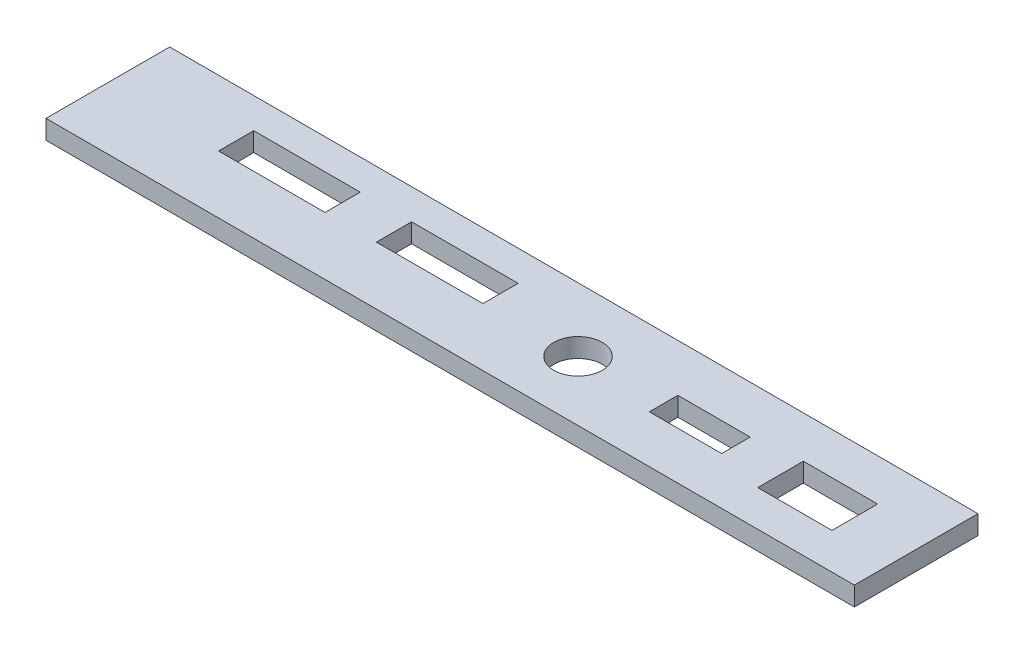
ISO-10303-21;
HEADER;
FILE_DESCRIPTION(('STEP AP214'),'2;1');
FILE_NAME('part.step','',(''),(''),'','','');
FILE_SCHEMA(('AUTOMOTIVE_DESIGN { 1 0 10303 214 1 1 1 1 }'));
ENDSEC;
DATA;
#1=APPLICATION_CONTEXT('core data for automotive mechanical design processes');
#2=APPLICATION_PROTOCOL_DEFINITION('international standard','automotive_design',2000,#1);
#3=PRODUCT_CONTEXT('',#1,'mechanical');
#4=PRODUCT('Part','Part','',(#3));
#5=PRODUCT_RELATED_PRODUCT_CATEGORY('part','',(#4));
#6=PRODUCT_DEFINITION_FORMATION('','',#4);
#7=PRODUCT_DEFINITION_CONTEXT('part definition',#1,'design');
#8=PRODUCT_DEFINITION('design','',#6,#7);
#9=PRODUCT_DEFINITION_SHAPE('','',#8);
#10=(LENGTH_UNIT() NAMED_UNIT(*) SI_UNIT(.MILLI.,.METRE.));
#11=(NAMED_UNIT(*) PLANE_ANGLE_UNIT() SI_UNIT($,.RADIAN.));
#12=(NAMED_UNIT(*) SI_UNIT($,.STERADIAN.) SOLID_ANGLE_UNIT());
#13=UNCERTAINTY_MEASURE_WITH_UNIT(LENGTH_MEASURE(1.E-05),#10,'distance_accuracy_value','');
#14=(GEOMETRIC_REPRESENTATION_CONTEXT(3) GLOBAL_UNCERTAINTY_ASSIGNED_CONTEXT((#13)) GLOBAL_UNIT_ASSIGNED_CONTEXT((#10,
#11,#12)) REPRESENTATION_CONTEXT('',''));
#15=CARTESIAN_POINT('',(0.,0.,0.));
#16=DIRECTION('',(0.,0.,1.));
#17=DIRECTION('',(1.,0.,0.));
#18=AXIS2_PLACEMENT_3D('',#15,#16,#17);
#19=CARTESIAN_POINT('',(0.,2.,0.));
#20=DIRECTION('',(0.,1.,0.));
#21=DIRECTION('',(0.,0.,1.));
#22=AXIS2_PLACEMENT_3D('',#19,#20,#21);
#23=PLANE('',#22);
#24=DIRECTION('',(-1.,0.,0.));
#25=VECTOR('',#24,1.);
#26=CARTESIAN_POINT('',(29.7913481709879,2.,-0.831151968342928));
#27=LINE('',#26,#25);
#28=CARTESIAN_POINT('',(29.7913481709879,2.,-0.831151968342928));
#29=VERTEX_POINT('',#28);
#30=CARTESIAN_POINT('',(18.5913481709879,2.,-0.831151968342926));
#31=VERTEX_POINT('',#30);
#32=EDGE_CURVE('E236',#29,#31,#27,.T.);
#33=ORIENTED_EDGE('',*,*,#32,.F.);
#34=DIRECTION('',(0.,0.,-1.));
#35=VECTOR('',#34,1.);
#36=CARTESIAN_POINT('',(29.7913481709879,2.,2.86884803165707));
#37=LINE('',#36,#35);
#38=CARTESIAN_POINT('',(29.7913481709879,2.,2.86884803165707));
#39=VERTEX_POINT('',#38);
#40=EDGE_CURVE('E233',#39,#29,#37,.T.);
#41=ORIENTED_EDGE('',*,*,#40,.F.);
#42=DIRECTION('',(1.,0.,0.));
#43=VECTOR('',#42,1.);
#44=CARTESIAN_POINT('',(29.7913481709879,2.,2.86884803165707));
#45=LINE('',#44,#43);
#46=CARTESIAN_POINT('',(18.5913481709879,2.,2.86884803165707));
#47=VERTEX_POINT('',#46);
#48=EDGE_CURVE('E244',#47,#39,#45,.T.);
#49=ORIENTED_EDGE('',*,*,#48,.F.);
#50=DIRECTION('',(0.,0.,1.));
#51=VECTOR('',#50,1.);
#52=CARTESIAN_POINT('',(18.5913481709879,2.,2.86884803165707));
#53=LINE('',#52,#51);
#54=EDGE_CURVE('E240',#31,#47,#53,.T.);
#55=ORIENTED_EDGE('',*,*,#54,.F.);
#56=EDGE_LOOP('',(#33,#41,#49,#55));
#57=FACE_BOUND('',#56,.T.);
#58=DIRECTION('',(-1.,0.,0.));
#59=VECTOR('',#58,1.);
#60=CARTESIAN_POINT('',(55.9913481709879,2.,0.96884803165707));
#61=LINE('',#60,#59);
#62=CARTESIAN_POINT('',(55.9913481709879,2.,0.96884803165707));
#63=VERTEX_POINT('',#62);
#64=CARTESIAN_POINT('',(48.3913481709879,2.,0.968848031657071));
#65=VERTEX_POINT('',#64);
#66=EDGE_CURVE('E279',#63,#65,#61,.T.);
#67=ORIENTED_EDGE('',*,*,#66,.F.);
#68=DIRECTION('',(0.,0.,-1.));
#69=VECTOR('',#68,1.);
#70=CARTESIAN_POINT('',(55.9913481709879,2.,3.96884803165707));
#71=LINE('',#70,#69);
#72=CARTESIAN_POINT('',(55.9913481709879,2.,3.96884803165707));
#73=VERTEX_POINT('',#72);
#74=EDGE_CURVE('E276',#73,#63,#71,.T.);
#75=ORIENTED_EDGE('',*,*,#74,.F.);
#76=DIRECTION('',(1.,0.,0.));
#77=VECTOR('',#76,1.);
#78=CARTESIAN_POINT('',(55.9913481709879,2.,3.96884803165707));
#79=LINE('',#78,#77);
#80=CARTESIAN_POINT('',(48.3913481709879,2.,3.96884803165707));
#81=VERTEX_POINT('',#80);
#82=EDGE_CURVE('E287',#81,#73,#79,.T.);
#83=ORIENTED_EDGE('',*,*,#82,.F.);
#84=DIRECTION('',(0.,0.,1.));
#85=VECTOR('',#84,1.);
#86=CARTESIAN_POINT('',(48.3913481709879,2.,3.96884803165707));
#87=LINE('',#86,#85);
#88=EDGE_CURVE('E283',#65,#81,#87,.T.);
#89=ORIENTED_EDGE('',*,*,#88,.F.);
#90=EDGE_LOOP('',(#67,#75,#83,#89));
#91=FACE_BOUND('',#90,.T.);
#92=DIRECTION('',(-1.,0.,0.));
#93=VECTOR('',#92,1.);
#94=CARTESIAN_POINT('',(68.7913481709879,2.,0.368848031657069));
#95=LINE('',#94,#93);
#96=CARTESIAN_POINT('',(68.7913481709879,2.,0.368848031657069));
#97=VERTEX_POINT('',#96);
#98=CARTESIAN_POINT('',(60.9913481709879,2.,0.36884803165707));
#99=VERTEX_POINT('',#98);
#100=EDGE_CURVE('E322',#97,#99,#95,.T.);
#101=ORIENTED_EDGE('',*,*,#100,.F.);
#102=DIRECTION('',(0.,0.,-1.));
#103=VECTOR('',#102,1.);
#104=CARTESIAN_POINT('',(68.7913481709879,2.,5.16884803165707));
#105=LINE('',#104,#103);
#106=CARTESIAN_POINT('',(68.7913481709879,2.,5.16884803165707));
#107=VERTEX_POINT('',#106);
#108=EDGE_CURVE('E319',#107,#97,#105,.T.);
#109=ORIENTED_EDGE('',*,*,#108,.F.);
#110=DIRECTION('',(1.,0.,0.));
#111=VECTOR('',#110,1.);
#112=CARTESIAN_POINT('',(68.7913481709879,2.,5.16884803165707));
#113=LINE('',#112,#111);
#114=CARTESIAN_POINT('',(60.9913481709879,2.,5.16884803165707));
#115=VERTEX_POINT('',#114);
#116=EDGE_CURVE('E330',#115,#107,#113,.T.);
#117=ORIENTED_EDGE('',*,*,#116,.F.);
#118=DIRECTION('',(0.,0.,1.));
#119=VECTOR('',#118,1.);
#120=CARTESIAN_POINT('',(60.9913481709879,2.,5.16884803165707));
#121=LINE('',#120,#119);
#122=EDGE_CURVE('E326',#99,#115,#121,.T.);
#123=ORIENTED_EDGE('',*,*,#122,.F.);
#124=EDGE_LOOP('',(#101,#109,#117,#123));
#125=FACE_BOUND('',#124,.T.);
#126=DIRECTION('',(0.,0.,1.));
#127=VECTOR('',#126,1.);
#128=CARTESIAN_POINT('',(-10.0513698630137,2.,-4.03115196834293));
#129=LINE('',#128,#127);
#130=CARTESIAN_POINT('',(-10.0513698630137,2.,-4.03115196834293));
#131=VERTEX_POINT('',#130);
#132=CARTESIAN_POINT('',(-10.0513698630137,2.,8.96884803165707));
#133=VERTEX_POINT('',#132);
#134=EDGE_CURVE('E362',#131,#133,#129,.T.);
#135=ORIENTED_EDGE('',*,*,#134,.T.);
#136=DIRECTION('',(1.,0.,0.));
#137=VECTOR('',#136,1.);
#138=CARTESIAN_POINT('',(-10.0513698630137,2.,8.96884803165707));
#139=LINE('',#138,#137);
#140=CARTESIAN_POINT('',(74.9486301369863,2.,8.96884803165707));
#141=VERTEX_POINT('',#140);
#142=EDGE_CURVE('E366',#133,#141,#139,.T.);
#143=ORIENTED_EDGE('',*,*,#142,.T.);
#144=DIRECTION('',(0.,0.,-1.));
#145=VECTOR('',#144,1.);
#146=CARTESIAN_POINT('',(74.9486301369863,2.,-4.03115196834293));
#147=LINE('',#146,#145);
#148=CARTESIAN_POINT('',(74.9486301369863,2.,-4.03115196834293));
#149=VERTEX_POINT('',#148);
#150=EDGE_CURVE('E370',#141,#149,#147,.T.);
#151=ORIENTED_EDGE('',*,*,#150,.T.);
#152=DIRECTION('',(-1.,0.,0.));
#153=VECTOR('',#152,1.);
#154=CARTESIAN_POINT('',(-10.0513698630137,2.,-4.03115196834293));
#155=LINE('',#154,#153);
#156=EDGE_CURVE('E373',#149,#131,#155,.T.);
#157=ORIENTED_EDGE('',*,*,#156,.T.);
#158=EDGE_LOOP('',(#135,#143,#151,#157));
#159=FACE_BOUND('',#158,.T.);
#160=CARTESIAN_POINT('',(39.5913481709879,2.,2.66884803165707));
#161=DIRECTION('',(0.,1.,0.));
#162=DIRECTION('',(0.,0.,1.));
#163=AXIS2_PLACEMENT_3D('',#160,#161,#162);
#164=CIRCLE('',#163,2.55);
#165=CARTESIAN_POINT('',(39.5913481709879,2.,5.21884803165707));
#166=VERTEX_POINT('',#165);
#167=EDGE_CURVE('E225',#166,#166,#164,.T.);
#168=ORIENTED_EDGE('',*,*,#167,.F.);
#169=EDGE_LOOP('',(#168));
#170=FACE_BOUND('',#169,.T.);
#171=DIRECTION('',(1.,0.,0.));
#172=VECTOR('',#171,1.);
#173=CARTESIAN_POINT('',(1.99134817098792,2.,2.86884803165707));
#174=LINE('',#173,#172);
#175=CARTESIAN_POINT('',(1.99134817098792,2.,2.86884803165707));
#176=VERTEX_POINT('',#175);
#177=CARTESIAN_POINT('',(13.1913481709879,2.,2.86884803165707));
#178=VERTEX_POINT('',#177);
#179=EDGE_CURVE('E186',#176,#178,#174,.T.);
#180=ORIENTED_EDGE('',*,*,#179,.F.);
#181=DIRECTION('',(0.,0.,1.));
#182=VECTOR('',#181,1.);
#183=CARTESIAN_POINT('',(1.99134817098792,2.,-0.831151968342934));
#184=LINE('',#183,#182);
#185=CARTESIAN_POINT('',(1.99134817098792,2.,-0.831151968342934));
#186=VERTEX_POINT('',#185);
#187=EDGE_CURVE('E177',#186,#176,#184,.T.);
#188=ORIENTED_EDGE('',*,*,#187,.F.);
#189=DIRECTION('',(-1.,0.,0.));
#190=VECTOR('',#189,1.);
#191=CARTESIAN_POINT('',(1.99134817098792,2.,-0.831151968342934));
#192=LINE('',#191,#190);
#193=CARTESIAN_POINT('',(13.1913481709879,2.,-0.831151968342934));
#194=VERTEX_POINT('',#193);
#195=EDGE_CURVE('E203',#194,#186,#192,.T.);
#196=ORIENTED_EDGE('',*,*,#195,.F.);
#197=DIRECTION('',(0.,0.,-1.));
#198=VECTOR('',#197,1.);
#199=CARTESIAN_POINT('',(13.1913481709879,2.,-0.831151968342934));
#200=LINE('',#199,#198);
#201=EDGE_CURVE('E199',#178,#194,#200,.T.);
#202=ORIENTED_EDGE('',*,*,#201,.F.);
#203=EDGE_LOOP('',(#180,#188,#196,#202));
#204=FACE_BOUND('',#203,.T.);
#205=ADVANCED_FACE('F39',(#57,#91,#125,#159,#170,#204),#23,.T.);
#206=CARTESIAN_POINT('',(0.,0.,0.));
#207=DIRECTION('',(0.,1.,0.));
#208=DIRECTION('',(0.,0.,1.));
#209=AXIS2_PLACEMENT_3D('',#206,#207,#208);
#210=PLANE('',#209);
#211=CARTESIAN_POINT('',(39.5913481709879,0.,2.66884803165707));
#212=DIRECTION('',(0.,1.,0.));
#213=DIRECTION('',(0.,0.,1.));
#214=AXIS2_PLACEMENT_3D('',#211,#212,#213);
#215=CIRCLE('',#214,2.55);
#216=CARTESIAN_POINT('',(39.5913481709879,0.,5.21884803165707));
#217=VERTEX_POINT('',#216);
#218=EDGE_CURVE('E195',#217,#217,#215,.T.);
#219=ORIENTED_EDGE('',*,*,#218,.T.);
#220=EDGE_LOOP('',(#219));
#221=FACE_BOUND('',#220,.T.);
#222=DIRECTION('',(0.,0.,-1.));
#223=VECTOR('',#222,1.);
#224=CARTESIAN_POINT('',(29.7913481709879,0.,2.86884803165707));
#225=LINE('',#224,#223);
#226=CARTESIAN_POINT('',(29.7913481709879,0.,2.86884803165707));
#227=VERTEX_POINT('',#226);
#228=CARTESIAN_POINT('',(29.7913481709879,0.,-0.831151968342928));
#229=VERTEX_POINT('',#228);
#230=EDGE_CURVE('E229',#227,#229,#225,.T.);
#231=ORIENTED_EDGE('',*,*,#230,.T.);
#232=DIRECTION('',(-1.,0.,0.));
#233=VECTOR('',#232,1.);
#234=CARTESIAN_POINT('',(29.7913481709879,0.,-0.831151968342928));
#235=LINE('',#234,#233);
#236=CARTESIAN_POINT('',(18.5913481709879,0.,-0.831151968342926));
#237=VERTEX_POINT('',#236);
#238=EDGE_CURVE('E251',#229,#237,#235,.T.);
#239=ORIENTED_EDGE('',*,*,#238,.T.);
#240=DIRECTION('',(0.,0.,1.));
#241=VECTOR('',#240,1.);
#242=CARTESIAN_POINT('',(18.5913481709879,0.,2.86884803165707));
#243=LINE('',#242,#241);
#244=CARTESIAN_POINT('',(18.5913481709879,0.,2.86884803165707));
#245=VERTEX_POINT('',#244);
#246=EDGE_CURVE('E255',#237,#245,#243,.T.);
#247=ORIENTED_EDGE('',*,*,#246,.T.);
#248=DIRECTION('',(1.,0.,0.));
#249=VECTOR('',#248,1.);
#250=CARTESIAN_POINT('',(29.7913481709879,0.,2.86884803165707));
#251=LINE('',#250,#249);
#252=EDGE_CURVE('E237',#245,#227,#251,.T.);
#253=ORIENTED_EDGE('',*,*,#252,.T.);
#254=EDGE_LOOP('',(#231,#239,#247,#253));
#255=FACE_BOUND('',#254,.T.);
#256=DIRECTION('',(0.,0.,-1.));
#257=VECTOR('',#256,1.);
#258=CARTESIAN_POINT('',(68.7913481709879,0.,5.16884803165707));
#259=LINE('',#258,#257);
#260=CARTESIAN_POINT('',(68.7913481709879,0.,5.16884803165707));
#261=VERTEX_POINT('',#260);
#262=CARTESIAN_POINT('',(68.7913481709879,0.,0.368848031657069));
#263=VERTEX_POINT('',#262);
#264=EDGE_CURVE('E318',#261,#263,#259,.T.);
#265=ORIENTED_EDGE('',*,*,#264,.T.);
#266=DIRECTION('',(-1.,0.,0.));
#267=VECTOR('',#266,1.);
#268=CARTESIAN_POINT('',(68.7913481709879,0.,0.368848031657069));
#269=LINE('',#268,#267);
#270=CARTESIAN_POINT('',(60.9913481709879,0.,0.36884803165707));
#271=VERTEX_POINT('',#270);
#272=EDGE_CURVE('E337',#263,#271,#269,.T.);
#273=ORIENTED_EDGE('',*,*,#272,.T.);
#274=DIRECTION('',(0.,0.,1.));
#275=VECTOR('',#274,1.);
#276=CARTESIAN_POINT('',(60.9913481709879,0.,5.16884803165707));
#277=LINE('',#276,#275);
#278=CARTESIAN_POINT('',(60.9913481709879,0.,5.16884803165707));
#279=VERTEX_POINT('',#278);
#280=EDGE_CURVE('E341',#271,#279,#277,.T.);
#281=ORIENTED_EDGE('',*,*,#280,.T.);
#282=DIRECTION('',(1.,0.,0.));
#283=VECTOR('',#282,1.);
#284=CARTESIAN_POINT('',(68.7913481709879,0.,5.16884803165707));
#285=LINE('',#284,#283);
#286=EDGE_CURVE('E323',#279,#261,#285,.T.);
#287=ORIENTED_EDGE('',*,*,#286,.T.);
#288=EDGE_LOOP('',(#265,#273,#281,#287));
#289=FACE_BOUND('',#288,.T.);
#290=DIRECTION('',(0.,0.,1.));
#291=VECTOR('',#290,1.);
#292=CARTESIAN_POINT('',(-10.0513698630137,0.,-4.03115196834293));
#293=LINE('',#292,#291);
#294=CARTESIAN_POINT('',(-10.0513698630137,0.,-4.03115196834293));
#295=VERTEX_POINT('',#294);
#296=CARTESIAN_POINT('',(-10.0513698630137,0.,8.96884803165707));
#297=VERTEX_POINT('',#296);
#298=EDGE_CURVE('E361',#295,#297,#293,.T.);
#299=ORIENTED_EDGE('',*,*,#298,.F.);
#300=DIRECTION('',(-1.,0.,0.));
#301=VECTOR('',#300,1.);
#302=CARTESIAN_POINT('',(-10.0513698630137,0.,-4.03115196834293));
#303=LINE('',#302,#301);
#304=CARTESIAN_POINT('',(74.9486301369863,0.,-4.03115196834293));
#305=VERTEX_POINT('',#304);
#306=EDGE_CURVE('E367',#305,#295,#303,.T.);
#307=ORIENTED_EDGE('',*,*,#306,.F.);
#308=DIRECTION('',(0.,0.,-1.));
#309=VECTOR('',#308,1.);
#310=CARTESIAN_POINT('',(74.9486301369863,0.,-4.03115196834293));
#311=LINE('',#310,#309);
#312=CARTESIAN_POINT('',(74.9486301369863,0.,8.96884803165707));
#313=VERTEX_POINT('',#312);
#314=EDGE_CURVE('E383',#313,#305,#311,.T.);
#315=ORIENTED_EDGE('',*,*,#314,.F.);
#316=DIRECTION('',(1.,0.,0.));
#317=VECTOR('',#316,1.);
#318=CARTESIAN_POINT('',(-10.0513698630137,0.,8.96884803165707));
#319=LINE('',#318,#317);
#320=EDGE_CURVE('E380',#297,#313,#319,.T.);
#321=ORIENTED_EDGE('',*,*,#320,.F.);
#322=EDGE_LOOP('',(#299,#307,#315,#321));
#323=FACE_BOUND('',#322,.T.);
#324=DIRECTION('',(0.,0.,-1.));
#325=VECTOR('',#324,1.);
#326=CARTESIAN_POINT('',(55.9913481709879,0.,3.96884803165707));
#327=LINE('',#326,#325);
#328=CARTESIAN_POINT('',(55.9913481709879,0.,3.96884803165707));
#329=VERTEX_POINT('',#328);
#330=CARTESIAN_POINT('',(55.9913481709879,0.,0.96884803165707));
#331=VERTEX_POINT('',#330);
#332=EDGE_CURVE('E275',#329,#331,#327,.T.);
#333=ORIENTED_EDGE('',*,*,#332,.T.);
#334=DIRECTION('',(-1.,0.,0.));
#335=VECTOR('',#334,1.);
#336=CARTESIAN_POINT('',(55.9913481709879,0.,0.96884803165707));
#337=LINE('',#336,#335);
#338=CARTESIAN_POINT('',(48.3913481709879,0.,0.968848031657071));
#339=VERTEX_POINT('',#338);
#340=EDGE_CURVE('E294',#331,#339,#337,.T.);
#341=ORIENTED_EDGE('',*,*,#340,.T.);
#342=DIRECTION('',(0.,0.,1.));
#343=VECTOR('',#342,1.);
#344=CARTESIAN_POINT('',(48.3913481709879,0.,3.96884803165707));
#345=LINE('',#344,#343);
#346=CARTESIAN_POINT('',(48.3913481709879,0.,3.96884803165707));
#347=VERTEX_POINT('',#346);
#348=EDGE_CURVE('E298',#339,#347,#345,.T.);
#349=ORIENTED_EDGE('',*,*,#348,.T.);
#350=DIRECTION('',(1.,0.,0.));
#351=VECTOR('',#350,1.);
#352=CARTESIAN_POINT('',(55.9913481709879,0.,3.96884803165707));
#353=LINE('',#352,#351);
#354=EDGE_CURVE('E280',#347,#329,#353,.T.);
#355=ORIENTED_EDGE('',*,*,#354,.T.);
#356=EDGE_LOOP('',(#333,#341,#349,#355));
#357=FACE_BOUND('',#356,.T.);
#358=DIRECTION('',(0.,0.,1.));
#359=VECTOR('',#358,1.);
#360=CARTESIAN_POINT('',(1.99134817098792,0.,-0.831151968342934));
#361=LINE('',#360,#359);
#362=CARTESIAN_POINT('',(1.99134817098792,0.,-0.831151968342934));
#363=VERTEX_POINT('',#362);
#364=CARTESIAN_POINT('',(1.99134817098792,0.,2.86884803165707));
#365=VERTEX_POINT('',#364);
#366=EDGE_CURVE('E63',#363,#365,#361,.T.);
#367=ORIENTED_EDGE('',*,*,#366,.T.);
#368=DIRECTION('',(1.,0.,0.));
#369=VECTOR('',#368,1.);
#370=CARTESIAN_POINT('',(1.99134817098792,0.,2.86884803165707));
#371=LINE('',#370,#369);
#372=CARTESIAN_POINT('',(13.1913481709879,0.,2.86884803165707));
#373=VERTEX_POINT('',#372);
#374=EDGE_CURVE('E193',#365,#373,#371,.T.);
#375=ORIENTED_EDGE('',*,*,#374,.T.);
#376=DIRECTION('',(0.,0.,-1.));
#377=VECTOR('',#376,1.);
#378=CARTESIAN_POINT('',(13.1913481709879,0.,-0.831151968342934));
#379=LINE('',#378,#377);
#380=CARTESIAN_POINT('',(13.1913481709879,0.,-0.831151968342934));
#381=VERTEX_POINT('',#380);
#382=EDGE_CURVE('E212',#373,#381,#379,.T.);
#383=ORIENTED_EDGE('',*,*,#382,.T.);
#384=DIRECTION('',(-1.,0.,0.));
#385=VECTOR('',#384,1.);
#386=CARTESIAN_POINT('',(1.99134817098792,0.,-0.831151968342934));
#387=LINE('',#386,#385);
#388=EDGE_CURVE('E187',#381,#363,#387,.T.);
#389=ORIENTED_EDGE('',*,*,#388,.T.);
#390=EDGE_LOOP('',(#367,#375,#383,#389));
#391=FACE_BOUND('',#390,.T.);
#392=ADVANCED_FACE('F406',(#221,#255,#289,#323,#357,#391),#210,.F.);
#393=CARTESIAN_POINT('',(-10.0513698630137,2.,-4.03115196834293));
#394=DIRECTION('',(1.,0.,0.));
#395=DIRECTION('',(0.,0.,-1.));
#396=AXIS2_PLACEMENT_3D('',#393,#394,#395);
#397=PLANE('',#396);
#398=ORIENTED_EDGE('',*,*,#298,.T.);
#399=DIRECTION('',(0.,-1.,0.));
#400=VECTOR('',#399,1.);
#401=CARTESIAN_POINT('',(-10.0513698630137,2.,8.96884803165707));
#402=LINE('',#401,#400);
#403=EDGE_CURVE('E11',#133,#297,#402,.T.);
#404=ORIENTED_EDGE('',*,*,#403,.F.);
#405=ORIENTED_EDGE('',*,*,#134,.F.);
#406=DIRECTION('',(0.,-1.,0.));
#407=VECTOR('',#406,1.);
#408=CARTESIAN_POINT('',(-10.0513698630137,2.,-4.03115196834293));
#409=LINE('',#408,#407);
#410=EDGE_CURVE('E376',#131,#295,#409,.T.);
#411=ORIENTED_EDGE('',*,*,#410,.T.);
#412=EDGE_LOOP('',(#398,#404,#405,#411));
#413=FACE_BOUND('',#412,.T.);
#414=ADVANCED_FACE('F41',(#413),#397,.F.);
#415=CARTESIAN_POINT('',(-10.0513698630137,2.,8.96884803165707));
#416=DIRECTION('',(0.,0.,-1.));
#417=DIRECTION('',(-1.,0.,0.));
#418=AXIS2_PLACEMENT_3D('',#415,#416,#417);
#419=PLANE('',#418);
#420=ORIENTED_EDGE('',*,*,#320,.T.);
#421=DIRECTION('',(0.,-1.,0.));
#422=VECTOR('',#421,1.);
#423=CARTESIAN_POINT('',(74.9486301369863,2.,8.96884803165707));
#424=LINE('',#423,#422);
#425=EDGE_CURVE('E48',#141,#313,#424,.T.);
#426=ORIENTED_EDGE('',*,*,#425,.F.);
#427=ORIENTED_EDGE('',*,*,#142,.F.);
#428=ORIENTED_EDGE('',*,*,#403,.T.);
#429=EDGE_LOOP('',(#420,#426,#427,#428));
#430=FACE_BOUND('',#429,.T.);
#431=ADVANCED_FACE('F417',(#430),#419,.F.);
#432=CARTESIAN_POINT('',(74.9486301369863,2.,-4.03115196834293));
#433=DIRECTION('',(-1.,0.,0.));
#434=DIRECTION('',(0.,0.,1.));
#435=AXIS2_PLACEMENT_3D('',#432,#433,#434);
#436=PLANE('',#435);
#437=ORIENTED_EDGE('',*,*,#314,.T.);
#438=DIRECTION('',(0.,-1.,0.));
#439=VECTOR('',#438,1.);
#440=CARTESIAN_POINT('',(74.9486301369863,2.,-4.03115196834293));
#441=LINE('',#440,#439);
#442=EDGE_CURVE('E391',#149,#305,#441,.T.);
#443=ORIENTED_EDGE('',*,*,#442,.F.);
#444=ORIENTED_EDGE('',*,*,#150,.F.);
#445=ORIENTED_EDGE('',*,*,#425,.T.);
#446=EDGE_LOOP('',(#437,#443,#444,#445));
#447=FACE_BOUND('',#446,.T.);
#448=ADVANCED_FACE('F400',(#447),#436,.F.);
#449=CARTESIAN_POINT('',(-10.0513698630137,2.,-4.03115196834293));
#450=DIRECTION('',(0.,0.,1.));
#451=DIRECTION('',(1.,0.,0.));
#452=AXIS2_PLACEMENT_3D('',#449,#450,#451);
#453=PLANE('',#452);
#454=ORIENTED_EDGE('',*,*,#306,.T.);
#455=ORIENTED_EDGE('',*,*,#410,.F.);
#456=ORIENTED_EDGE('',*,*,#156,.F.);
#457=ORIENTED_EDGE('',*,*,#442,.T.);
#458=EDGE_LOOP('',(#454,#455,#456,#457));
#459=FACE_BOUND('',#458,.T.);
#460=ADVANCED_FACE('F410',(#459),#453,.F.);
#461=CARTESIAN_POINT('',(68.7913481709879,2.,5.16884803165707));
#462=DIRECTION('',(-1.,0.,0.));
#463=DIRECTION('',(0.,0.,1.));
#464=AXIS2_PLACEMENT_3D('',#461,#462,#463);
#465=PLANE('',#464);
#466=ORIENTED_EDGE('',*,*,#264,.F.);
#467=DIRECTION('',(0.,-1.,0.));
#468=VECTOR('',#467,1.);
#469=CARTESIAN_POINT('',(68.7913481709879,2.,5.16884803165707));
#470=LINE('',#469,#468);
#471=EDGE_CURVE('E333',#107,#261,#470,.T.);
#472=ORIENTED_EDGE('',*,*,#471,.F.);
#473=ORIENTED_EDGE('',*,*,#108,.T.);
#474=DIRECTION('',(0.,-1.,0.));
#475=VECTOR('',#474,1.);
#476=CARTESIAN_POINT('',(68.7913481709879,2.,0.368848031657069));
#477=LINE('',#476,#475);
#478=EDGE_CURVE('E357',#97,#263,#477,.T.);
#479=ORIENTED_EDGE('',*,*,#478,.T.);
#480=EDGE_LOOP('',(#466,#472,#473,#479));
#481=FACE_BOUND('',#480,.T.);
#482=ADVANCED_FACE('F435',(#481),#465,.T.);
#483=CARTESIAN_POINT('',(68.7913481709879,2.,0.368848031657069));
#484=DIRECTION('',(0.,0.,1.));
#485=DIRECTION('',(1.,0.,0.));
#486=AXIS2_PLACEMENT_3D('',#483,#484,#485);
#487=PLANE('',#486);
#488=ORIENTED_EDGE('',*,*,#272,.F.);
#489=ORIENTED_EDGE('',*,*,#478,.F.);
#490=ORIENTED_EDGE('',*,*,#100,.T.);
#491=DIRECTION('',(0.,-1.,0.));
#492=VECTOR('',#491,1.);
#493=CARTESIAN_POINT('',(60.9913481709879,2.,0.36884803165707));
#494=LINE('',#493,#492);
#495=EDGE_CURVE('E354',#99,#271,#494,.T.);
#496=ORIENTED_EDGE('',*,*,#495,.T.);
#497=EDGE_LOOP('',(#488,#489,#490,#496));
#498=FACE_BOUND('',#497,.T.);
#499=ADVANCED_FACE('F442',(#498),#487,.T.);
#500=CARTESIAN_POINT('',(60.9913481709879,2.,5.16884803165707));
#501=DIRECTION('',(1.,0.,0.));
#502=DIRECTION('',(0.,0.,-1.));
#503=AXIS2_PLACEMENT_3D('',#500,#501,#502);
#504=PLANE('',#503);
#505=ORIENTED_EDGE('',*,*,#280,.F.);
#506=ORIENTED_EDGE('',*,*,#495,.F.);
#507=ORIENTED_EDGE('',*,*,#122,.T.);
#508=DIRECTION('',(0.,-1.,0.));
#509=VECTOR('',#508,1.);
#510=CARTESIAN_POINT('',(60.9913481709879,2.,5.16884803165707));
#511=LINE('',#510,#509);
#512=EDGE_CURVE('E351',#115,#279,#511,.T.);
#513=ORIENTED_EDGE('',*,*,#512,.T.);
#514=EDGE_LOOP('',(#505,#506,#507,#513));
#515=FACE_BOUND('',#514,.T.);
#516=ADVANCED_FACE('F447',(#515),#504,.T.);
#517=CARTESIAN_POINT('',(68.7913481709879,2.,5.16884803165707));
#518=DIRECTION('',(0.,0.,-1.));
#519=DIRECTION('',(-1.,0.,0.));
#520=AXIS2_PLACEMENT_3D('',#517,#518,#519);
#521=PLANE('',#520);
#522=ORIENTED_EDGE('',*,*,#286,.F.);
#523=ORIENTED_EDGE('',*,*,#512,.F.);
#524=ORIENTED_EDGE('',*,*,#116,.T.);
#525=ORIENTED_EDGE('',*,*,#471,.T.);
#526=EDGE_LOOP('',(#522,#523,#524,#525));
#527=FACE_BOUND('',#526,.T.);
#528=ADVANCED_FACE('F455',(#527),#521,.T.);
#529=CARTESIAN_POINT('',(55.9913481709879,2.,3.96884803165707));
#530=DIRECTION('',(-1.,0.,0.));
#531=DIRECTION('',(0.,0.,1.));
#532=AXIS2_PLACEMENT_3D('',#529,#530,#531);
#533=PLANE('',#532);
#534=ORIENTED_EDGE('',*,*,#332,.F.);
#535=DIRECTION('',(0.,-1.,0.));
#536=VECTOR('',#535,1.);
#537=CARTESIAN_POINT('',(55.9913481709879,2.,3.96884803165707));
#538=LINE('',#537,#536);
#539=EDGE_CURVE('E290',#73,#329,#538,.T.);
#540=ORIENTED_EDGE('',*,*,#539,.F.);
#541=ORIENTED_EDGE('',*,*,#74,.T.);
#542=DIRECTION('',(0.,-1.,0.));
#543=VECTOR('',#542,1.);
#544=CARTESIAN_POINT('',(55.9913481709879,2.,0.96884803165707));
#545=LINE('',#544,#543);
#546=EDGE_CURVE('E314',#63,#331,#545,.T.);
#547=ORIENTED_EDGE('',*,*,#546,.T.);
#548=EDGE_LOOP('',(#534,#540,#541,#547));
#549=FACE_BOUND('',#548,.T.);
#550=ADVANCED_FACE('F468',(#549),#533,.T.);
#551=CARTESIAN_POINT('',(55.9913481709879,2.,0.96884803165707));
#552=DIRECTION('',(0.,0.,1.));
#553=DIRECTION('',(1.,0.,0.));
#554=AXIS2_PLACEMENT_3D('',#551,#552,#553);
#555=PLANE('',#554);
#556=ORIENTED_EDGE('',*,*,#340,.F.);
#557=ORIENTED_EDGE('',*,*,#546,.F.);
#558=ORIENTED_EDGE('',*,*,#66,.T.);
#559=DIRECTION('',(0.,-1.,0.));
#560=VECTOR('',#559,1.);
#561=CARTESIAN_POINT('',(48.3913481709879,2.,0.968848031657071));
#562=LINE('',#561,#560);
#563=EDGE_CURVE('E311',#65,#339,#562,.T.);
#564=ORIENTED_EDGE('',*,*,#563,.T.);
#565=EDGE_LOOP('',(#556,#557,#558,#564));
#566=FACE_BOUND('',#565,.T.);
#567=ADVANCED_FACE('F473',(#566),#555,.T.);
#568=CARTESIAN_POINT('',(48.3913481709879,2.,3.96884803165707));
#569=DIRECTION('',(1.,0.,0.));
#570=DIRECTION('',(0.,0.,-1.));
#571=AXIS2_PLACEMENT_3D('',#568,#569,#570);
#572=PLANE('',#571);
#573=ORIENTED_EDGE('',*,*,#348,.F.);
#574=ORIENTED_EDGE('',*,*,#563,.F.);
#575=ORIENTED_EDGE('',*,*,#88,.T.);
#576=DIRECTION('',(0.,-1.,0.));
#577=VECTOR('',#576,1.);
#578=CARTESIAN_POINT('',(48.3913481709879,2.,3.96884803165707));
#579=LINE('',#578,#577);
#580=EDGE_CURVE('E308',#81,#347,#579,.T.);
#581=ORIENTED_EDGE('',*,*,#580,.T.);
#582=EDGE_LOOP('',(#573,#574,#575,#581));
#583=FACE_BOUND('',#582,.T.);
#584=ADVANCED_FACE('F477',(#583),#572,.T.);
#585=CARTESIAN_POINT('',(55.9913481709879,2.,3.96884803165707));
#586=DIRECTION('',(0.,0.,-1.));
#587=DIRECTION('',(-1.,0.,0.));
#588=AXIS2_PLACEMENT_3D('',#585,#586,#587);
#589=PLANE('',#588);
#590=ORIENTED_EDGE('',*,*,#354,.F.);
#591=ORIENTED_EDGE('',*,*,#580,.F.);
#592=ORIENTED_EDGE('',*,*,#82,.T.);
#593=ORIENTED_EDGE('',*,*,#539,.T.);
#594=EDGE_LOOP('',(#590,#591,#592,#593));
#595=FACE_BOUND('',#594,.T.);
#596=ADVANCED_FACE('F481',(#595),#589,.T.);
#597=CARTESIAN_POINT('',(29.7913481709879,2.,2.86884803165707));
#598=DIRECTION('',(-1.,0.,0.));
#599=DIRECTION('',(0.,0.,1.));
#600=AXIS2_PLACEMENT_3D('',#597,#598,#599);
#601=PLANE('',#600);
#602=ORIENTED_EDGE('',*,*,#230,.F.);
#603=DIRECTION('',(0.,-1.,0.));
#604=VECTOR('',#603,1.);
#605=CARTESIAN_POINT('',(29.7913481709879,2.,2.86884803165707));
#606=LINE('',#605,#604);
#607=EDGE_CURVE('E247',#39,#227,#606,.T.);
#608=ORIENTED_EDGE('',*,*,#607,.F.);
#609=ORIENTED_EDGE('',*,*,#40,.T.);
#610=DIRECTION('',(0.,-1.,0.));
#611=VECTOR('',#610,1.);
#612=CARTESIAN_POINT('',(29.7913481709879,2.,-0.831151968342928));
#613=LINE('',#612,#611);
#614=EDGE_CURVE('E271',#29,#229,#613,.T.);
#615=ORIENTED_EDGE('',*,*,#614,.T.);
#616=EDGE_LOOP('',(#602,#608,#609,#615));
#617=FACE_BOUND('',#616,.T.);
#618=ADVANCED_FACE('F485',(#617),#601,.T.);
#619=CARTESIAN_POINT('',(29.7913481709879,2.,-0.831151968342928));
#620=DIRECTION('',(0.,0.,1.));
#621=DIRECTION('',(1.,0.,0.));
#622=AXIS2_PLACEMENT_3D('',#619,#620,#621);
#623=PLANE('',#622);
#624=ORIENTED_EDGE('',*,*,#238,.F.);
#625=ORIENTED_EDGE('',*,*,#614,.F.);
#626=ORIENTED_EDGE('',*,*,#32,.T.);
#627=DIRECTION('',(0.,-1.,0.));
#628=VECTOR('',#627,1.);
#629=CARTESIAN_POINT('',(18.5913481709879,2.,-0.831151968342926));
#630=LINE('',#629,#628);
#631=EDGE_CURVE('E268',#31,#237,#630,.T.);
#632=ORIENTED_EDGE('',*,*,#631,.T.);
#633=EDGE_LOOP('',(#624,#625,#626,#632));
#634=FACE_BOUND('',#633,.T.);
#635=ADVANCED_FACE('F489',(#634),#623,.T.);
#636=CARTESIAN_POINT('',(18.5913481709879,2.,2.86884803165707));
#637=DIRECTION('',(1.,0.,0.));
#638=DIRECTION('',(0.,0.,-1.));
#639=AXIS2_PLACEMENT_3D('',#636,#637,#638);
#640=PLANE('',#639);
#641=ORIENTED_EDGE('',*,*,#246,.F.);
#642=ORIENTED_EDGE('',*,*,#631,.F.);
#643=ORIENTED_EDGE('',*,*,#54,.T.);
#644=DIRECTION('',(0.,-1.,0.));
#645=VECTOR('',#644,1.);
#646=CARTESIAN_POINT('',(18.5913481709879,2.,2.86884803165707));
#647=LINE('',#646,#645);
#648=EDGE_CURVE('E265',#47,#245,#647,.T.);
#649=ORIENTED_EDGE('',*,*,#648,.T.);
#650=EDGE_LOOP('',(#641,#642,#643,#649));
#651=FACE_BOUND('',#650,.T.);
#652=ADVANCED_FACE('F493',(#651),#640,.T.);
#653=CARTESIAN_POINT('',(29.7913481709879,2.,2.86884803165707));
#654=DIRECTION('',(0.,0.,-1.));
#655=DIRECTION('',(-1.,0.,0.));
#656=AXIS2_PLACEMENT_3D('',#653,#654,#655);
#657=PLANE('',#656);
#658=ORIENTED_EDGE('',*,*,#252,.F.);
#659=ORIENTED_EDGE('',*,*,#648,.F.);
#660=ORIENTED_EDGE('',*,*,#48,.T.);
#661=ORIENTED_EDGE('',*,*,#607,.T.);
#662=EDGE_LOOP('',(#658,#659,#660,#661));
#663=FACE_BOUND('',#662,.T.);
#664=ADVANCED_FACE('F497',(#663),#657,.T.);
#665=CARTESIAN_POINT('',(39.5913481709879,2.,2.66884803165707));
#666=DIRECTION('',(0.,-1.,0.));
#667=DIRECTION('',(0.,0.,-1.));
#668=AXIS2_PLACEMENT_3D('',#665,#666,#667);
#669=CYLINDRICAL_SURFACE('',#668,2.55);
#670=ORIENTED_EDGE('',*,*,#167,.T.);
#671=EDGE_LOOP('',(#670));
#672=FACE_BOUND('',#671,.T.);
#673=ORIENTED_EDGE('',*,*,#218,.F.);
#674=EDGE_LOOP('',(#673));
#675=FACE_BOUND('',#674,.T.);
#676=ADVANCED_FACE('F501',(#672,#675),#669,.F.);
#677=CARTESIAN_POINT('',(1.99134817098792,2.,-0.831151968342934));
#678=DIRECTION('',(1.,0.,0.));
#679=DIRECTION('',(0.,0.,-1.));
#680=AXIS2_PLACEMENT_3D('',#677,#678,#679);
#681=PLANE('',#680);
#682=ORIENTED_EDGE('',*,*,#366,.F.);
#683=DIRECTION('',(0.,-1.,0.));
#684=VECTOR('',#683,1.);
#685=CARTESIAN_POINT('',(1.99134817098792,2.,-0.831151968342934));
#686=LINE('',#685,#684);
#687=EDGE_CURVE('E181',#186,#363,#686,.T.);
#688=ORIENTED_EDGE('',*,*,#687,.F.);
#689=ORIENTED_EDGE('',*,*,#187,.T.);
#690=DIRECTION('',(0.,-1.,0.));
#691=VECTOR('',#690,1.);
#692=CARTESIAN_POINT('',(1.99134817098792,2.,2.86884803165707));
#693=LINE('',#692,#691);
#694=EDGE_CURVE('E180',#176,#365,#693,.T.);
#695=ORIENTED_EDGE('',*,*,#694,.T.);
#696=EDGE_LOOP('',(#682,#688,#689,#695));
#697=FACE_BOUND('',#696,.T.);
#698=ADVANCED_FACE('F179',(#697),#681,.T.);
#699=CARTESIAN_POINT('',(1.99134817098792,2.,2.86884803165707));
#700=DIRECTION('',(0.,0.,-1.));
#701=DIRECTION('',(-1.,0.,0.));
#702=AXIS2_PLACEMENT_3D('',#699,#700,#701);
#703=PLANE('',#702);
#704=ORIENTED_EDGE('',*,*,#374,.F.);
#705=ORIENTED_EDGE('',*,*,#694,.F.);
#706=ORIENTED_EDGE('',*,*,#179,.T.);
#707=DIRECTION('',(0.,-1.,0.));
#708=VECTOR('',#707,1.);
#709=CARTESIAN_POINT('',(13.1913481709879,2.,2.86884803165707));
#710=LINE('',#709,#708);
#711=EDGE_CURVE('E196',#178,#373,#710,.T.);
#712=ORIENTED_EDGE('',*,*,#711,.T.);
#713=EDGE_LOOP('',(#704,#705,#706,#712));
#714=FACE_BOUND('',#713,.T.);
#715=ADVANCED_FACE('F190',(#714),#703,.T.);
#716=CARTESIAN_POINT('',(13.1913481709879,2.,-0.831151968342934));
#717=DIRECTION('',(-1.,0.,0.));
#718=DIRECTION('',(0.,0.,1.));
#719=AXIS2_PLACEMENT_3D('',#716,#717,#718);
#720=PLANE('',#719);
#721=ORIENTED_EDGE('',*,*,#382,.F.);
#722=ORIENTED_EDGE('',*,*,#711,.F.);
#723=ORIENTED_EDGE('',*,*,#201,.T.);
#724=DIRECTION('',(0.,-1.,0.));
#725=VECTOR('',#724,1.);
#726=CARTESIAN_POINT('',(13.1913481709879,2.,-0.831151968342934));
#727=LINE('',#726,#725);
#728=EDGE_CURVE('E55',#194,#381,#727,.T.);
#729=ORIENTED_EDGE('',*,*,#728,.T.);
#730=EDGE_LOOP('',(#721,#722,#723,#729));
#731=FACE_BOUND('',#730,.T.);
#732=ADVANCED_FACE('F510',(#731),#720,.T.);
#733=CARTESIAN_POINT('',(1.99134817098792,2.,-0.831151968342934));
#734=DIRECTION('',(0.,0.,1.));
#735=DIRECTION('',(1.,0.,0.));
#736=AXIS2_PLACEMENT_3D('',#733,#734,#735);
#737=PLANE('',#736);
#738=ORIENTED_EDGE('',*,*,#388,.F.);
#739=ORIENTED_EDGE('',*,*,#728,.F.);
#740=ORIENTED_EDGE('',*,*,#195,.T.);
#741=ORIENTED_EDGE('',*,*,#687,.T.);
#742=EDGE_LOOP('',(#738,#739,#740,#741));
#743=FACE_BOUND('',#742,.T.);
#744=ADVANCED_FACE('F513',(#743),#737,.T.);
#745=CLOSED_SHELL('',(#205,#392,#414,#431,#448,#460,#482,#499,#516,#528,#550,#567,#584,#596,
#618,#635,#652,#664,#676,#698,#715,#732,#744));
#746=MANIFOLD_SOLID_BREP('B2',#745);
#747=ADVANCED_BREP_SHAPE_REPRESENTATION('',(#18,#746),#14);
#748=SHAPE_DEFINITION_REPRESENTATION(#9,#747);
ENDSEC;
END-ISO-10303-21;
